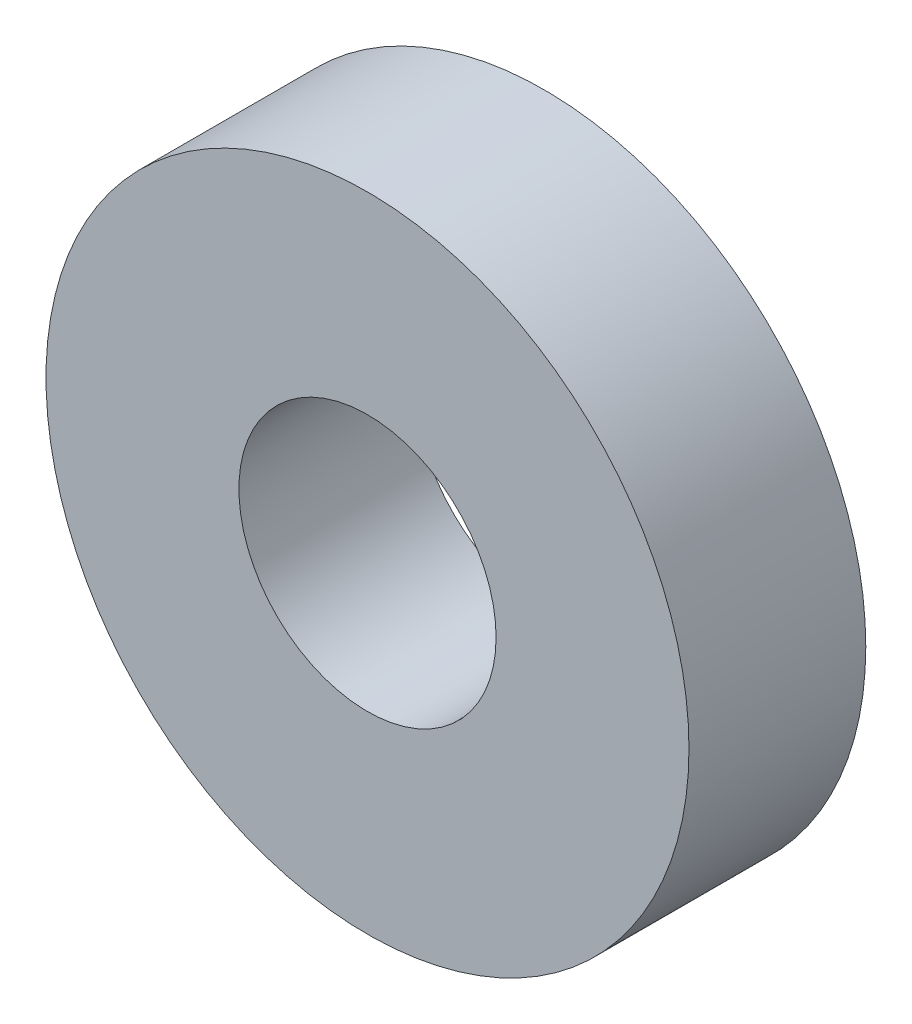
ISO-10303-21;
HEADER;
FILE_DESCRIPTION(('STEP AP214'),'2;1');
FILE_NAME('part.step','',(''),(''),'','','');
FILE_SCHEMA(('AUTOMOTIVE_DESIGN { 1 0 10303 214 1 1 1 1 }'));
ENDSEC;
DATA;
#1=APPLICATION_CONTEXT('core data for automotive mechanical design processes');
#2=APPLICATION_PROTOCOL_DEFINITION('international standard','automotive_design',2000,#1);
#3=PRODUCT_CONTEXT('',#1,'mechanical');
#4=PRODUCT('Part','Part','',(#3));
#5=PRODUCT_RELATED_PRODUCT_CATEGORY('part','',(#4));
#6=PRODUCT_DEFINITION_FORMATION('','',#4);
#7=PRODUCT_DEFINITION_CONTEXT('part definition',#1,'design');
#8=PRODUCT_DEFINITION('design','',#6,#7);
#9=PRODUCT_DEFINITION_SHAPE('','',#8);
#10=(LENGTH_UNIT() NAMED_UNIT(*) SI_UNIT(.MILLI.,.METRE.));
#11=(NAMED_UNIT(*) PLANE_ANGLE_UNIT() SI_UNIT($,.RADIAN.));
#12=(NAMED_UNIT(*) SI_UNIT($,.STERADIAN.) SOLID_ANGLE_UNIT());
#13=UNCERTAINTY_MEASURE_WITH_UNIT(LENGTH_MEASURE(1.E-05),#10,'distance_accuracy_value','');
#14=(GEOMETRIC_REPRESENTATION_CONTEXT(3) GLOBAL_UNCERTAINTY_ASSIGNED_CONTEXT((#13)) GLOBAL_UNIT_ASSIGNED_CONTEXT((#10,
#11,#12)) REPRESENTATION_CONTEXT('',''));
#15=CARTESIAN_POINT('',(0.,0.,0.));
#16=DIRECTION('',(0.,0.,1.));
#17=DIRECTION('',(1.,0.,0.));
#18=AXIS2_PLACEMENT_3D('',#15,#16,#17);
#19=CARTESIAN_POINT('',(0.,0.,5.5));
#20=DIRECTION('',(0.,0.,1.));
#21=DIRECTION('',(1.,0.,0.));
#22=AXIS2_PLACEMENT_3D('',#19,#20,#21);
#23=PLANE('',#22);
#24=CARTESIAN_POINT('',(0.,0.,5.5));
#25=DIRECTION('',(0.,0.,1.));
#26=DIRECTION('',(1.,0.,0.));
#27=AXIS2_PLACEMENT_3D('',#24,#25,#26);
#28=CIRCLE('',#27,10.);
#29=CARTESIAN_POINT('',(10.,0.,5.5));
#30=VERTEX_POINT('',#29);
#31=EDGE_CURVE('E10',#30,#30,#28,.T.);
#32=ORIENTED_EDGE('',*,*,#31,.T.);
#33=EDGE_LOOP('',(#32));
#34=FACE_BOUND('',#33,.T.);
#35=CARTESIAN_POINT('',(0.,0.,5.5));
#36=DIRECTION('',(0.,0.,1.));
#37=DIRECTION('',(1.,0.,0.));
#38=AXIS2_PLACEMENT_3D('',#35,#36,#37);
#39=CIRCLE('',#38,4.);
#40=CARTESIAN_POINT('',(4.,0.,5.5));
#41=VERTEX_POINT('',#40);
#42=EDGE_CURVE('E48',#41,#41,#39,.T.);
#43=ORIENTED_EDGE('',*,*,#42,.F.);
#44=EDGE_LOOP('',(#43));
#45=FACE_BOUND('',#44,.T.);
#46=ADVANCED_FACE('F37',(#34,#45),#23,.T.);
#47=CARTESIAN_POINT('',(0.,0.,0.));
#48=DIRECTION('',(0.,0.,1.));
#49=DIRECTION('',(1.,0.,0.));
#50=AXIS2_PLACEMENT_3D('',#47,#48,#49);
#51=PLANE('',#50);
#52=CARTESIAN_POINT('',(0.,0.,0.));
#53=DIRECTION('',(0.,0.,1.));
#54=DIRECTION('',(1.,0.,0.));
#55=AXIS2_PLACEMENT_3D('',#52,#53,#54);
#56=CIRCLE('',#55,10.);
#57=CARTESIAN_POINT('',(10.,0.,0.));
#58=VERTEX_POINT('',#57);
#59=EDGE_CURVE('E41',#58,#58,#56,.T.);
#60=ORIENTED_EDGE('',*,*,#59,.F.);
#61=EDGE_LOOP('',(#60));
#62=FACE_BOUND('',#61,.T.);
#63=CARTESIAN_POINT('',(0.,0.,0.));
#64=DIRECTION('',(0.,0.,1.));
#65=DIRECTION('',(1.,0.,0.));
#66=AXIS2_PLACEMENT_3D('',#63,#64,#65);
#67=CIRCLE('',#66,4.);
#68=CARTESIAN_POINT('',(4.,0.,0.));
#69=VERTEX_POINT('',#68);
#70=EDGE_CURVE('E50',#69,#69,#67,.T.);
#71=ORIENTED_EDGE('',*,*,#70,.T.);
#72=EDGE_LOOP('',(#71));
#73=FACE_BOUND('',#72,.T.);
#74=ADVANCED_FACE('F60',(#62,#73),#51,.F.);
#75=CARTESIAN_POINT('',(0.,0.,5.5));
#76=DIRECTION('',(0.,0.,-1.));
#77=DIRECTION('',(-1.,0.,0.));
#78=AXIS2_PLACEMENT_3D('',#75,#76,#77);
#79=CYLINDRICAL_SURFACE('',#78,10.);
#80=ORIENTED_EDGE('',*,*,#31,.F.);
#81=EDGE_LOOP('',(#80));
#82=FACE_BOUND('',#81,.T.);
#83=ORIENTED_EDGE('',*,*,#59,.T.);
#84=EDGE_LOOP('',(#83));
#85=FACE_BOUND('',#84,.T.);
#86=ADVANCED_FACE('F39',(#82,#85),#79,.T.);
#87=CARTESIAN_POINT('',(0.,0.,5.5));
#88=DIRECTION('',(0.,0.,-1.));
#89=DIRECTION('',(-1.,0.,0.));
#90=AXIS2_PLACEMENT_3D('',#87,#88,#89);
#91=CYLINDRICAL_SURFACE('',#90,4.);
#92=ORIENTED_EDGE('',*,*,#42,.T.);
#93=EDGE_LOOP('',(#92));
#94=FACE_BOUND('',#93,.T.);
#95=ORIENTED_EDGE('',*,*,#70,.F.);
#96=EDGE_LOOP('',(#95));
#97=FACE_BOUND('',#96,.T.);
#98=ADVANCED_FACE('F56',(#94,#97),#91,.F.);
#99=CLOSED_SHELL('',(#46,#74,#86,#98));
#100=MANIFOLD_SOLID_BREP('B2',#99);
#101=ADVANCED_BREP_SHAPE_REPRESENTATION('',(#18,#100),#14);
#102=SHAPE_DEFINITION_REPRESENTATION(#9,#101);
ENDSEC;
END-ISO-10303-21;
